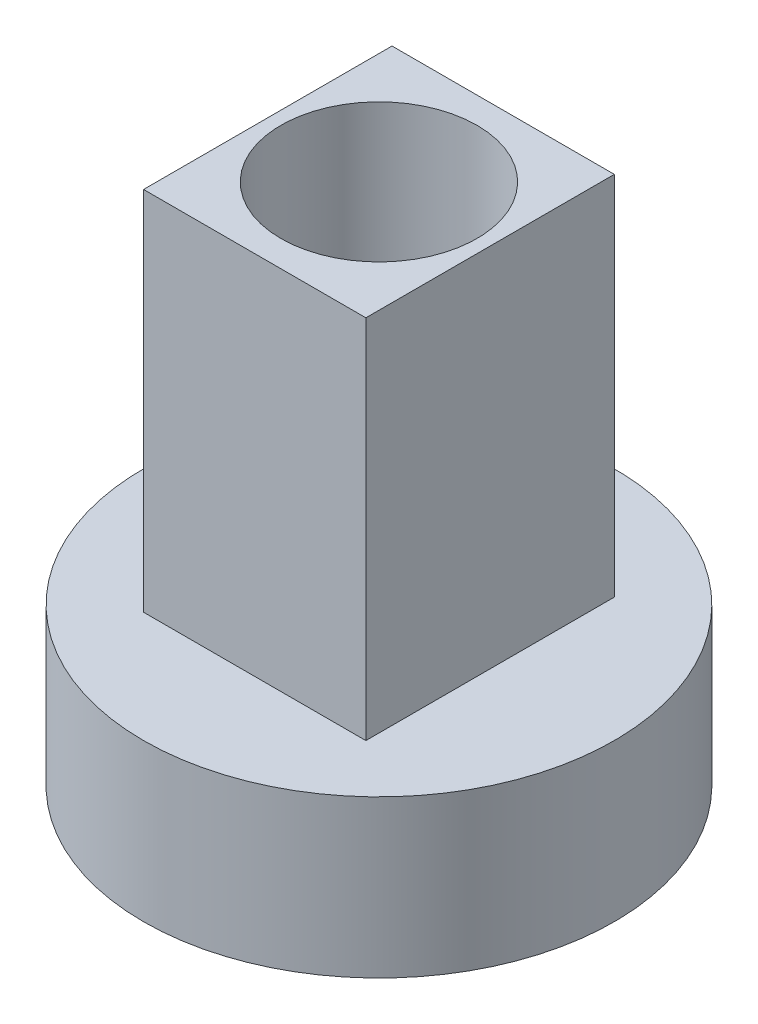
ISO-10303-21;
HEADER;
FILE_DESCRIPTION(('STEP AP214'),'2;1');
FILE_NAME('part.step','',(''),(''),'','','');
FILE_SCHEMA(('AUTOMOTIVE_DESIGN { 1 0 10303 214 1 1 1 1 }'));
ENDSEC;
DATA;
#1=APPLICATION_CONTEXT('core data for automotive mechanical design processes');
#2=APPLICATION_PROTOCOL_DEFINITION('international standard','automotive_design',2000,#1);
#3=PRODUCT_CONTEXT('',#1,'mechanical');
#4=PRODUCT('Part','Part','',(#3));
#5=PRODUCT_RELATED_PRODUCT_CATEGORY('part','',(#4));
#6=PRODUCT_DEFINITION_FORMATION('','',#4);
#7=PRODUCT_DEFINITION_CONTEXT('part definition',#1,'design');
#8=PRODUCT_DEFINITION('design','',#6,#7);
#9=PRODUCT_DEFINITION_SHAPE('','',#8);
#10=(LENGTH_UNIT() NAMED_UNIT(*) SI_UNIT(.MILLI.,.METRE.));
#11=(NAMED_UNIT(*) PLANE_ANGLE_UNIT() SI_UNIT($,.RADIAN.));
#12=(NAMED_UNIT(*) SI_UNIT($,.STERADIAN.) SOLID_ANGLE_UNIT());
#13=UNCERTAINTY_MEASURE_WITH_UNIT(LENGTH_MEASURE(1.E-05),#10,'distance_accuracy_value','');
#14=(GEOMETRIC_REPRESENTATION_CONTEXT(3) GLOBAL_UNCERTAINTY_ASSIGNED_CONTEXT((#13)) GLOBAL_UNIT_ASSIGNED_CONTEXT((#10,
#11,#12)) REPRESENTATION_CONTEXT('',''));
#15=CARTESIAN_POINT('',(0.,0.,0.));
#16=DIRECTION('',(0.,0.,1.));
#17=DIRECTION('',(1.,0.,0.));
#18=AXIS2_PLACEMENT_3D('',#15,#16,#17);
#19=CARTESIAN_POINT('',(0.,0.,0.));
#20=DIRECTION('',(0.,1.,0.));
#21=DIRECTION('',(0.,0.,1.));
#22=AXIS2_PLACEMENT_3D('',#19,#20,#21);
#23=PLANE('',#22);
#24=CARTESIAN_POINT('',(0.,0.,0.));
#25=DIRECTION('',(0.,1.,0.));
#26=DIRECTION('',(0.,0.,1.));
#27=AXIS2_PLACEMENT_3D('',#24,#25,#26);
#28=CIRCLE('',#27,37.5);
#29=CARTESIAN_POINT('',(0.,0.,37.5));
#30=VERTEX_POINT('',#29);
#31=EDGE_CURVE('E204',#30,#30,#28,.T.);
#32=ORIENTED_EDGE('',*,*,#31,.T.);
#33=EDGE_LOOP('',(#32));
#34=FACE_BOUND('',#33,.T.);
#35=CARTESIAN_POINT('',(0.,0.,0.));
#36=DIRECTION('',(0.,1.,0.));
#37=DIRECTION('',(0.,0.,1.));
#38=AXIS2_PLACEMENT_3D('',#35,#36,#37);
#39=CIRCLE('',#38,40.5);
#40=CARTESIAN_POINT('',(0.,0.,40.5));
#41=VERTEX_POINT('',#40);
#42=EDGE_CURVE('E184',#41,#41,#39,.T.);
#43=ORIENTED_EDGE('',*,*,#42,.F.);
#44=EDGE_LOOP('',(#43));
#45=FACE_BOUND('',#44,.T.);
#46=ADVANCED_FACE('F36',(#34,#45),#23,.F.);
#47=CARTESIAN_POINT('',(0.,60.,0.));
#48=DIRECTION('',(0.,1.,0.));
#49=DIRECTION('',(0.,0.,1.));
#50=AXIS2_PLACEMENT_3D('',#47,#48,#49);
#51=PLANE('',#50);
#52=CARTESIAN_POINT('',(0.,60.,0.));
#53=DIRECTION('',(0.,1.,0.));
#54=DIRECTION('',(0.,0.,1.));
#55=AXIS2_PLACEMENT_3D('',#52,#53,#54);
#56=CIRCLE('',#55,90.);
#57=CARTESIAN_POINT('',(0.,60.,90.));
#58=VERTEX_POINT('',#57);
#59=EDGE_CURVE('E11',#58,#58,#56,.T.);
#60=ORIENTED_EDGE('',*,*,#59,.T.);
#61=EDGE_LOOP('',(#60));
#62=FACE_BOUND('',#61,.T.);
#63=DIRECTION('',(-1.,0.,0.));
#64=VECTOR('',#63,1.);
#65=CARTESIAN_POINT('',(-42.5,60.,-47.5));
#66=LINE('',#65,#64);
#67=CARTESIAN_POINT('',(42.5,60.,-47.5));
#68=VERTEX_POINT('',#67);
#69=CARTESIAN_POINT('',(-42.5,60.,-47.5));
#70=VERTEX_POINT('',#69);
#71=EDGE_CURVE('E220',#68,#70,#66,.T.);
#72=ORIENTED_EDGE('',*,*,#71,.F.);
#73=DIRECTION('',(0.,0.,-1.));
#74=VECTOR('',#73,1.);
#75=CARTESIAN_POINT('',(42.5,60.,-47.5));
#76=LINE('',#75,#74);
#77=CARTESIAN_POINT('',(42.5,60.,47.5));
#78=VERTEX_POINT('',#77);
#79=EDGE_CURVE('E207',#78,#68,#76,.T.);
#80=ORIENTED_EDGE('',*,*,#79,.F.);
#81=DIRECTION('',(1.,0.,0.));
#82=VECTOR('',#81,1.);
#83=CARTESIAN_POINT('',(-42.5,60.,47.5));
#84=LINE('',#83,#82);
#85=CARTESIAN_POINT('',(-42.5,60.,47.5));
#86=VERTEX_POINT('',#85);
#87=EDGE_CURVE('E74',#86,#78,#84,.T.);
#88=ORIENTED_EDGE('',*,*,#87,.F.);
#89=DIRECTION('',(0.,0.,1.));
#90=VECTOR('',#89,1.);
#91=CARTESIAN_POINT('',(-42.5,60.,-47.5));
#92=LINE('',#91,#90);
#93=EDGE_CURVE('E222',#70,#86,#92,.T.);
#94=ORIENTED_EDGE('',*,*,#93,.F.);
#95=EDGE_LOOP('',(#72,#80,#88,#94));
#96=FACE_BOUND('',#95,.T.);
#97=ADVANCED_FACE('F247',(#62,#96),#51,.T.);
#98=CARTESIAN_POINT('',(0.,60.,0.));
#99=DIRECTION('',(0.,-1.,0.));
#100=DIRECTION('',(0.,0.,-1.));
#101=AXIS2_PLACEMENT_3D('',#98,#99,#100);
#102=CYLINDRICAL_SURFACE('',#101,90.);
#103=ORIENTED_EDGE('',*,*,#59,.F.);
#104=EDGE_LOOP('',(#103));
#105=FACE_BOUND('',#104,.T.);
#106=CARTESIAN_POINT('',(0.,0.,0.));
#107=DIRECTION('',(0.,1.,0.));
#108=DIRECTION('',(0.,0.,1.));
#109=AXIS2_PLACEMENT_3D('',#106,#107,#108);
#110=CIRCLE('',#109,90.);
#111=CARTESIAN_POINT('',(0.,0.,90.));
#112=VERTEX_POINT('',#111);
#113=EDGE_CURVE('E40',#112,#112,#110,.T.);
#114=ORIENTED_EDGE('',*,*,#113,.T.);
#115=EDGE_LOOP('',(#114));
#116=FACE_BOUND('',#115,.T.);
#117=ADVANCED_FACE('F38',(#105,#116),#102,.T.);
#118=CARTESIAN_POINT('',(0.,0.,0.));
#119=DIRECTION('',(0.,1.,0.));
#120=DIRECTION('',(0.,0.,1.));
#121=AXIS2_PLACEMENT_3D('',#118,#119,#120);
#122=CIRCLE('',#121,87.);
#123=CARTESIAN_POINT('',(0.,0.,87.));
#124=VERTEX_POINT('',#123);
#125=EDGE_CURVE('E166',#124,#124,#122,.T.);
#126=ORIENTED_EDGE('',*,*,#125,.T.);
#127=EDGE_LOOP('',(#126));
#128=FACE_BOUND('',#127,.T.);
#129=ORIENTED_EDGE('',*,*,#113,.F.);
#130=EDGE_LOOP('',(#129));
#131=FACE_BOUND('',#130,.T.);
#132=ADVANCED_FACE('F236',(#128,#131),#23,.F.);
#133=CARTESIAN_POINT('',(42.5,200.,-47.5));
#134=DIRECTION('',(-1.,0.,0.));
#135=DIRECTION('',(0.,0.,1.));
#136=AXIS2_PLACEMENT_3D('',#133,#134,#135);
#137=PLANE('',#136);
#138=ORIENTED_EDGE('',*,*,#79,.T.);
#139=DIRECTION('',(0.,-1.,0.));
#140=VECTOR('',#139,1.);
#141=CARTESIAN_POINT('',(42.5,200.,-47.5));
#142=LINE('',#141,#140);
#143=CARTESIAN_POINT('',(42.5,200.,-47.5));
#144=VERTEX_POINT('',#143);
#145=EDGE_CURVE('E230',#144,#68,#142,.T.);
#146=ORIENTED_EDGE('',*,*,#145,.F.);
#147=DIRECTION('',(0.,0.,-1.));
#148=VECTOR('',#147,1.);
#149=CARTESIAN_POINT('',(42.5,200.,-47.5));
#150=LINE('',#149,#148);
#151=CARTESIAN_POINT('',(42.5,200.,47.5));
#152=VERTEX_POINT('',#151);
#153=EDGE_CURVE('E211',#152,#144,#150,.T.);
#154=ORIENTED_EDGE('',*,*,#153,.F.);
#155=DIRECTION('',(0.,-1.,0.));
#156=VECTOR('',#155,1.);
#157=CARTESIAN_POINT('',(42.5,200.,47.5));
#158=LINE('',#157,#156);
#159=EDGE_CURVE('E217',#152,#78,#158,.T.);
#160=ORIENTED_EDGE('',*,*,#159,.T.);
#161=EDGE_LOOP('',(#138,#146,#154,#160));
#162=FACE_BOUND('',#161,.T.);
#163=ADVANCED_FACE('F238',(#162),#137,.F.);
#164=CARTESIAN_POINT('',(-42.5,200.,-47.5));
#165=DIRECTION('',(0.,0.,1.));
#166=DIRECTION('',(1.,0.,0.));
#167=AXIS2_PLACEMENT_3D('',#164,#165,#166);
#168=PLANE('',#167);
#169=ORIENTED_EDGE('',*,*,#71,.T.);
#170=DIRECTION('',(0.,-1.,0.));
#171=VECTOR('',#170,1.);
#172=CARTESIAN_POINT('',(-42.5,200.,-47.5));
#173=LINE('',#172,#171);
#174=CARTESIAN_POINT('',(-42.5,200.,-47.5));
#175=VERTEX_POINT('',#174);
#176=EDGE_CURVE('E227',#175,#70,#173,.T.);
#177=ORIENTED_EDGE('',*,*,#176,.F.);
#178=DIRECTION('',(-1.,0.,0.));
#179=VECTOR('',#178,1.);
#180=CARTESIAN_POINT('',(-42.5,200.,-47.5));
#181=LINE('',#180,#179);
#182=EDGE_CURVE('E81',#144,#175,#181,.T.);
#183=ORIENTED_EDGE('',*,*,#182,.F.);
#184=ORIENTED_EDGE('',*,*,#145,.T.);
#185=EDGE_LOOP('',(#169,#177,#183,#184));
#186=FACE_BOUND('',#185,.T.);
#187=ADVANCED_FACE('F244',(#186),#168,.F.);
#188=CARTESIAN_POINT('',(-42.5,200.,-47.5));
#189=DIRECTION('',(1.,0.,0.));
#190=DIRECTION('',(0.,0.,-1.));
#191=AXIS2_PLACEMENT_3D('',#188,#189,#190);
#192=PLANE('',#191);
#193=ORIENTED_EDGE('',*,*,#93,.T.);
#194=DIRECTION('',(0.,-1.,0.));
#195=VECTOR('',#194,1.);
#196=CARTESIAN_POINT('',(-42.5,200.,47.5));
#197=LINE('',#196,#195);
#198=CARTESIAN_POINT('',(-42.5,200.,47.5));
#199=VERTEX_POINT('',#198);
#200=EDGE_CURVE('E51',#199,#86,#197,.T.);
#201=ORIENTED_EDGE('',*,*,#200,.F.);
#202=DIRECTION('',(0.,0.,1.));
#203=VECTOR('',#202,1.);
#204=CARTESIAN_POINT('',(-42.5,200.,-47.5));
#205=LINE('',#204,#203);
#206=EDGE_CURVE('E214',#175,#199,#205,.T.);
#207=ORIENTED_EDGE('',*,*,#206,.F.);
#208=ORIENTED_EDGE('',*,*,#176,.T.);
#209=EDGE_LOOP('',(#193,#201,#207,#208));
#210=FACE_BOUND('',#209,.T.);
#211=ADVANCED_FACE('F323',(#210),#192,.F.);
#212=CARTESIAN_POINT('',(-42.5,200.,47.5));
#213=DIRECTION('',(0.,0.,-1.));
#214=DIRECTION('',(-1.,0.,0.));
#215=AXIS2_PLACEMENT_3D('',#212,#213,#214);
#216=PLANE('',#215);
#217=ORIENTED_EDGE('',*,*,#87,.T.);
#218=ORIENTED_EDGE('',*,*,#159,.F.);
#219=DIRECTION('',(1.,0.,0.));
#220=VECTOR('',#219,1.);
#221=CARTESIAN_POINT('',(-42.5,200.,47.5));
#222=LINE('',#221,#220);
#223=EDGE_CURVE('E59',#199,#152,#222,.T.);
#224=ORIENTED_EDGE('',*,*,#223,.F.);
#225=ORIENTED_EDGE('',*,*,#200,.T.);
#226=EDGE_LOOP('',(#217,#218,#224,#225));
#227=FACE_BOUND('',#226,.T.);
#228=ADVANCED_FACE('F319',(#227),#216,.F.);
#229=CARTESIAN_POINT('',(0.,200.,0.));
#230=DIRECTION('',(0.,1.,0.));
#231=DIRECTION('',(0.,0.,1.));
#232=AXIS2_PLACEMENT_3D('',#229,#230,#231);
#233=PLANE('',#232);
#234=CARTESIAN_POINT('',(0.,200.,0.));
#235=DIRECTION('',(0.,1.,0.));
#236=DIRECTION('',(0.,0.,1.));
#237=AXIS2_PLACEMENT_3D('',#234,#235,#236);
#238=CIRCLE('',#237,37.5);
#239=CARTESIAN_POINT('',(0.,200.,37.5));
#240=VERTEX_POINT('',#239);
#241=EDGE_CURVE('E208',#240,#240,#238,.T.);
#242=ORIENTED_EDGE('',*,*,#241,.F.);
#243=EDGE_LOOP('',(#242));
#244=FACE_BOUND('',#243,.T.);
#245=ORIENTED_EDGE('',*,*,#153,.T.);
#246=ORIENTED_EDGE('',*,*,#182,.T.);
#247=ORIENTED_EDGE('',*,*,#206,.T.);
#248=ORIENTED_EDGE('',*,*,#223,.T.);
#249=EDGE_LOOP('',(#245,#246,#247,#248));
#250=FACE_BOUND('',#249,.T.);
#251=ADVANCED_FACE('F315',(#244,#250),#233,.T.);
#252=CARTESIAN_POINT('',(0.,0.,0.));
#253=DIRECTION('',(0.,1.,0.));
#254=DIRECTION('',(0.,0.,1.));
#255=AXIS2_PLACEMENT_3D('',#252,#253,#254);
#256=CYLINDRICAL_SURFACE('',#255,37.5);
#257=ORIENTED_EDGE('',*,*,#31,.F.);
#258=EDGE_LOOP('',(#257));
#259=FACE_BOUND('',#258,.T.);
#260=ORIENTED_EDGE('',*,*,#241,.T.);
#261=EDGE_LOOP('',(#260));
#262=FACE_BOUND('',#261,.T.);
#263=ADVANCED_FACE('F263',(#259,#262),#256,.F.);
#264=CARTESIAN_POINT('',(0.,0.,0.));
#265=DIRECTION('',(0.,1.,0.));
#266=DIRECTION('',(0.,0.,1.));
#267=AXIS2_PLACEMENT_3D('',#264,#265,#266);
#268=CYLINDRICAL_SURFACE('',#267,40.5);
#269=ORIENTED_EDGE('',*,*,#42,.T.);
#270=EDGE_LOOP('',(#269));
#271=FACE_BOUND('',#270,.T.);
#272=CARTESIAN_POINT('',(0.,57.,0.));
#273=DIRECTION('',(0.,1.,0.));
#274=DIRECTION('',(0.,0.,1.));
#275=AXIS2_PLACEMENT_3D('',#272,#273,#274);
#276=CIRCLE('',#275,40.5);
#277=CARTESIAN_POINT('',(-39.5,57.,8.9442719099992));
#278=VERTEX_POINT('',#277);
#279=CARTESIAN_POINT('',(-39.5,57.,-8.94427190999919));
#280=VERTEX_POINT('',#279);
#281=EDGE_CURVE('E203',#278,#280,#276,.F.);
#282=ORIENTED_EDGE('',*,*,#281,.T.);
#283=DIRECTION('',(0.,1.,0.));
#284=VECTOR('',#283,1.);
#285=CARTESIAN_POINT('',(-39.5,0.,-8.94427190999919));
#286=LINE('',#285,#284);
#287=CARTESIAN_POINT('',(-39.5,197.,-8.94427190999919));
#288=VERTEX_POINT('',#287);
#289=EDGE_CURVE('E157',#288,#280,#286,.F.);
#290=ORIENTED_EDGE('',*,*,#289,.F.);
#291=CARTESIAN_POINT('',(0.,197.,0.));
#292=DIRECTION('',(0.,1.,0.));
#293=DIRECTION('',(0.,0.,1.));
#294=AXIS2_PLACEMENT_3D('',#291,#292,#293);
#295=CIRCLE('',#294,40.5);
#296=CARTESIAN_POINT('',(39.5,197.,-8.9442719099992));
#297=VERTEX_POINT('',#296);
#298=EDGE_CURVE('E181',#297,#288,#295,.T.);
#299=ORIENTED_EDGE('',*,*,#298,.F.);
#300=DIRECTION('',(0.,1.,0.));
#301=VECTOR('',#300,1.);
#302=CARTESIAN_POINT('',(39.5,0.,-8.9442719099992));
#303=LINE('',#302,#301);
#304=CARTESIAN_POINT('',(39.5,57.,-8.9442719099992));
#305=VERTEX_POINT('',#304);
#306=EDGE_CURVE('E191',#297,#305,#303,.F.);
#307=ORIENTED_EDGE('',*,*,#306,.T.);
#308=CARTESIAN_POINT('',(39.5,57.,8.94427190999919));
#309=VERTEX_POINT('',#308);
#310=EDGE_CURVE('E200',#305,#309,#276,.F.);
#311=ORIENTED_EDGE('',*,*,#310,.T.);
#312=DIRECTION('',(0.,1.,0.));
#313=VECTOR('',#312,1.);
#314=CARTESIAN_POINT('',(39.5,0.,8.94427190999919));
#315=LINE('',#314,#313);
#316=CARTESIAN_POINT('',(39.5,197.,8.94427190999919));
#317=VERTEX_POINT('',#316);
#318=EDGE_CURVE('E194',#317,#309,#315,.F.);
#319=ORIENTED_EDGE('',*,*,#318,.F.);
#320=CARTESIAN_POINT('',(-39.5,197.,8.9442719099992));
#321=VERTEX_POINT('',#320);
#322=EDGE_CURVE('E185',#321,#317,#295,.T.);
#323=ORIENTED_EDGE('',*,*,#322,.F.);
#324=DIRECTION('',(0.,1.,0.));
#325=VECTOR('',#324,1.);
#326=CARTESIAN_POINT('',(-39.5,0.,8.9442719099992));
#327=LINE('',#326,#325);
#328=EDGE_CURVE('E196',#321,#278,#327,.F.);
#329=ORIENTED_EDGE('',*,*,#328,.T.);
#330=EDGE_LOOP('',(#282,#290,#299,#307,#311,#319,#323,#329));
#331=FACE_BOUND('',#330,.T.);
#332=ADVANCED_FACE('F260',(#271,#331),#268,.T.);
#333=CARTESIAN_POINT('',(-39.5,200.,-47.5));
#334=DIRECTION('',(1.,0.,0.));
#335=DIRECTION('',(0.,0.,-1.));
#336=AXIS2_PLACEMENT_3D('',#333,#334,#335);
#337=PLANE('',#336);
#338=ORIENTED_EDGE('',*,*,#289,.T.);
#339=DIRECTION('',(0.,0.,1.));
#340=VECTOR('',#339,1.);
#341=CARTESIAN_POINT('',(-39.5,57.,-47.5));
#342=LINE('',#341,#340);
#343=CARTESIAN_POINT('',(-39.5,57.,-44.5));
#344=VERTEX_POINT('',#343);
#345=EDGE_CURVE('E136',#344,#280,#342,.T.);
#346=ORIENTED_EDGE('',*,*,#345,.F.);
#347=DIRECTION('',(0.,-1.,0.));
#348=VECTOR('',#347,1.);
#349=CARTESIAN_POINT('',(-39.5,200.,-44.5));
#350=LINE('',#349,#348);
#351=CARTESIAN_POINT('',(-39.5,197.,-44.5));
#352=VERTEX_POINT('',#351);
#353=EDGE_CURVE('E146',#352,#344,#350,.T.);
#354=ORIENTED_EDGE('',*,*,#353,.F.);
#355=DIRECTION('',(0.,0.,1.));
#356=VECTOR('',#355,1.);
#357=CARTESIAN_POINT('',(-39.5,197.,-47.5));
#358=LINE('',#357,#356);
#359=EDGE_CURVE('E178',#352,#288,#358,.T.);
#360=ORIENTED_EDGE('',*,*,#359,.T.);
#361=EDGE_LOOP('',(#338,#346,#354,#360));
#362=FACE_BOUND('',#361,.T.);
#363=ADVANCED_FACE('F156',(#362),#337,.T.);
#364=CARTESIAN_POINT('',(39.5,200.,-47.5));
#365=DIRECTION('',(-1.,0.,0.));
#366=DIRECTION('',(0.,0.,1.));
#367=AXIS2_PLACEMENT_3D('',#364,#365,#366);
#368=PLANE('',#367);
#369=ORIENTED_EDGE('',*,*,#318,.T.);
#370=DIRECTION('',(0.,0.,-1.));
#371=VECTOR('',#370,1.);
#372=CARTESIAN_POINT('',(39.5,57.,-47.5));
#373=LINE('',#372,#371);
#374=CARTESIAN_POINT('',(39.5,57.,44.5));
#375=VERTEX_POINT('',#374);
#376=EDGE_CURVE('E143',#375,#309,#373,.T.);
#377=ORIENTED_EDGE('',*,*,#376,.F.);
#378=DIRECTION('',(0.,-1.,0.));
#379=VECTOR('',#378,1.);
#380=CARTESIAN_POINT('',(39.5,200.,44.5));
#381=LINE('',#380,#379);
#382=CARTESIAN_POINT('',(39.5,197.,44.5));
#383=VERTEX_POINT('',#382);
#384=EDGE_CURVE('E170',#383,#375,#381,.T.);
#385=ORIENTED_EDGE('',*,*,#384,.F.);
#386=DIRECTION('',(0.,0.,-1.));
#387=VECTOR('',#386,1.);
#388=CARTESIAN_POINT('',(39.5,197.,-47.5));
#389=LINE('',#388,#387);
#390=EDGE_CURVE('E167',#383,#317,#389,.T.);
#391=ORIENTED_EDGE('',*,*,#390,.T.);
#392=EDGE_LOOP('',(#369,#377,#385,#391));
#393=FACE_BOUND('',#392,.T.);
#394=ADVANCED_FACE('F281',(#393),#368,.T.);
#395=CARTESIAN_POINT('',(0.,197.,0.));
#396=DIRECTION('',(0.,1.,0.));
#397=DIRECTION('',(0.,0.,1.));
#398=AXIS2_PLACEMENT_3D('',#395,#396,#397);
#399=PLANE('',#398);
#400=ORIENTED_EDGE('',*,*,#298,.T.);
#401=ORIENTED_EDGE('',*,*,#359,.F.);
#402=DIRECTION('',(-1.,0.,0.));
#403=VECTOR('',#402,1.);
#404=CARTESIAN_POINT('',(-42.5,197.,-44.5));
#405=LINE('',#404,#403);
#406=CARTESIAN_POINT('',(39.5,197.,-44.5));
#407=VERTEX_POINT('',#406);
#408=EDGE_CURVE('E149',#407,#352,#405,.T.);
#409=ORIENTED_EDGE('',*,*,#408,.F.);
#410=EDGE_CURVE('E161',#297,#407,#389,.T.);
#411=ORIENTED_EDGE('',*,*,#410,.F.);
#412=EDGE_LOOP('',(#400,#401,#409,#411));
#413=FACE_BOUND('',#412,.T.);
#414=ADVANCED_FACE('F290',(#413),#399,.F.);
#415=CARTESIAN_POINT('',(0.,57.,0.));
#416=DIRECTION('',(0.,1.,0.));
#417=DIRECTION('',(0.,0.,1.));
#418=AXIS2_PLACEMENT_3D('',#415,#416,#417);
#419=PLANE('',#418);
#420=CARTESIAN_POINT('',(0.,57.,0.));
#421=DIRECTION('',(0.,1.,0.));
#422=DIRECTION('',(0.,0.,1.));
#423=AXIS2_PLACEMENT_3D('',#420,#421,#422);
#424=CIRCLE('',#423,87.);
#425=CARTESIAN_POINT('',(0.,57.,87.));
#426=VERTEX_POINT('',#425);
#427=EDGE_CURVE('E188',#426,#426,#424,.T.);
#428=ORIENTED_EDGE('',*,*,#427,.F.);
#429=EDGE_LOOP('',(#428));
#430=FACE_BOUND('',#429,.T.);
#431=CARTESIAN_POINT('',(-39.5,57.,44.5));
#432=VERTEX_POINT('',#431);
#433=EDGE_CURVE('E142',#278,#432,#342,.T.);
#434=ORIENTED_EDGE('',*,*,#433,.T.);
#435=DIRECTION('',(1.,0.,0.));
#436=VECTOR('',#435,1.);
#437=CARTESIAN_POINT('',(-42.5,57.,44.5));
#438=LINE('',#437,#436);
#439=EDGE_CURVE('E159',#432,#375,#438,.T.);
#440=ORIENTED_EDGE('',*,*,#439,.T.);
#441=ORIENTED_EDGE('',*,*,#376,.T.);
#442=ORIENTED_EDGE('',*,*,#310,.F.);
#443=CARTESIAN_POINT('',(39.5,57.,-44.5));
#444=VERTEX_POINT('',#443);
#445=EDGE_CURVE('E138',#305,#444,#373,.T.);
#446=ORIENTED_EDGE('',*,*,#445,.T.);
#447=DIRECTION('',(-1.,0.,0.));
#448=VECTOR('',#447,1.);
#449=CARTESIAN_POINT('',(-42.5,57.,-44.5));
#450=LINE('',#449,#448);
#451=EDGE_CURVE('E132',#444,#344,#450,.T.);
#452=ORIENTED_EDGE('',*,*,#451,.T.);
#453=ORIENTED_EDGE('',*,*,#345,.T.);
#454=ORIENTED_EDGE('',*,*,#281,.F.);
#455=EDGE_LOOP('',(#434,#440,#441,#442,#446,#452,#453,#454));
#456=FACE_BOUND('',#455,.T.);
#457=ADVANCED_FACE('F134',(#430,#456),#419,.F.);
#458=CARTESIAN_POINT('',(0.,60.,0.));
#459=DIRECTION('',(0.,-1.,0.));
#460=DIRECTION('',(0.,0.,-1.));
#461=AXIS2_PLACEMENT_3D('',#458,#459,#460);
#462=CYLINDRICAL_SURFACE('',#461,87.);
#463=ORIENTED_EDGE('',*,*,#427,.T.);
#464=EDGE_LOOP('',(#463));
#465=FACE_BOUND('',#464,.T.);
#466=ORIENTED_EDGE('',*,*,#125,.F.);
#467=EDGE_LOOP('',(#466));
#468=FACE_BOUND('',#467,.T.);
#469=ADVANCED_FACE('F286',(#465,#468),#462,.F.);
#470=ORIENTED_EDGE('',*,*,#410,.T.);
#471=DIRECTION('',(0.,-1.,0.));
#472=VECTOR('',#471,1.);
#473=CARTESIAN_POINT('',(39.5,200.,-44.5));
#474=LINE('',#473,#472);
#475=EDGE_CURVE('E153',#407,#444,#474,.T.);
#476=ORIENTED_EDGE('',*,*,#475,.T.);
#477=ORIENTED_EDGE('',*,*,#445,.F.);
#478=ORIENTED_EDGE('',*,*,#306,.F.);
#479=EDGE_LOOP('',(#470,#476,#477,#478));
#480=FACE_BOUND('',#479,.T.);
#481=ADVANCED_FACE('F296',(#480),#368,.T.);
#482=CARTESIAN_POINT('',(-42.5,200.,-44.5));
#483=DIRECTION('',(0.,0.,1.));
#484=DIRECTION('',(1.,0.,0.));
#485=AXIS2_PLACEMENT_3D('',#482,#483,#484);
#486=PLANE('',#485);
#487=ORIENTED_EDGE('',*,*,#451,.F.);
#488=ORIENTED_EDGE('',*,*,#475,.F.);
#489=ORIENTED_EDGE('',*,*,#408,.T.);
#490=ORIENTED_EDGE('',*,*,#353,.T.);
#491=EDGE_LOOP('',(#487,#488,#489,#490));
#492=FACE_BOUND('',#491,.T.);
#493=ADVANCED_FACE('F147',(#492),#486,.T.);
#494=CARTESIAN_POINT('',(-39.5,197.,44.5));
#495=VERTEX_POINT('',#494);
#496=EDGE_CURVE('E175',#321,#495,#358,.T.);
#497=ORIENTED_EDGE('',*,*,#496,.T.);
#498=DIRECTION('',(0.,-1.,0.));
#499=VECTOR('',#498,1.);
#500=CARTESIAN_POINT('',(-39.5,200.,44.5));
#501=LINE('',#500,#499);
#502=EDGE_CURVE('E154',#495,#432,#501,.T.);
#503=ORIENTED_EDGE('',*,*,#502,.T.);
#504=ORIENTED_EDGE('',*,*,#433,.F.);
#505=ORIENTED_EDGE('',*,*,#328,.F.);
#506=EDGE_LOOP('',(#497,#503,#504,#505));
#507=FACE_BOUND('',#506,.T.);
#508=ADVANCED_FACE('F272',(#507),#337,.T.);
#509=CARTESIAN_POINT('',(-42.5,200.,44.5));
#510=DIRECTION('',(0.,0.,-1.));
#511=DIRECTION('',(-1.,0.,0.));
#512=AXIS2_PLACEMENT_3D('',#509,#510,#511);
#513=PLANE('',#512);
#514=ORIENTED_EDGE('',*,*,#439,.F.);
#515=ORIENTED_EDGE('',*,*,#502,.F.);
#516=DIRECTION('',(1.,0.,0.));
#517=VECTOR('',#516,1.);
#518=CARTESIAN_POINT('',(-42.5,197.,44.5));
#519=LINE('',#518,#517);
#520=EDGE_CURVE('E172',#495,#383,#519,.T.);
#521=ORIENTED_EDGE('',*,*,#520,.T.);
#522=ORIENTED_EDGE('',*,*,#384,.T.);
#523=EDGE_LOOP('',(#514,#515,#521,#522));
#524=FACE_BOUND('',#523,.T.);
#525=ADVANCED_FACE('F276',(#524),#513,.T.);
#526=ORIENTED_EDGE('',*,*,#390,.F.);
#527=ORIENTED_EDGE('',*,*,#520,.F.);
#528=ORIENTED_EDGE('',*,*,#496,.F.);
#529=ORIENTED_EDGE('',*,*,#322,.T.);
#530=EDGE_LOOP('',(#526,#527,#528,#529));
#531=FACE_BOUND('',#530,.T.);
#532=ADVANCED_FACE('F300',(#531),#399,.F.);
#533=CLOSED_SHELL('',(#46,#97,#117,#132,#163,#187,#211,#228,#251,#263,#332,#363,#394,#414,#457,
#469,#481,#493,#508,#525,#532));
#534=MANIFOLD_SOLID_BREP('B2',#533);
#535=ADVANCED_BREP_SHAPE_REPRESENTATION('',(#18,#534),#14);
#536=SHAPE_DEFINITION_REPRESENTATION(#9,#535);
ENDSEC;
END-ISO-10303-21;
